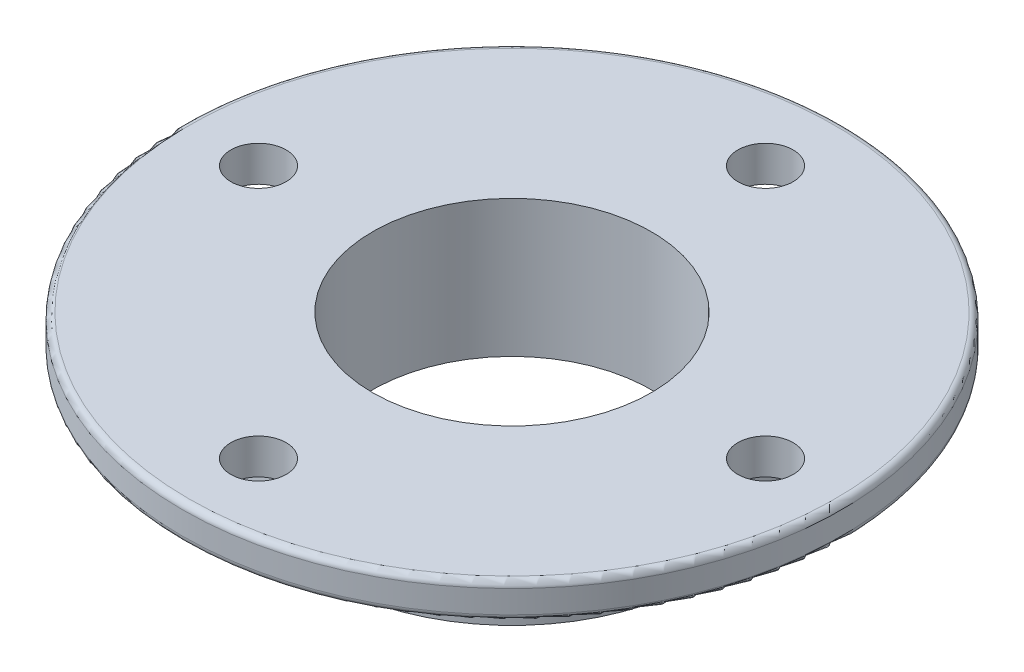
ISO-10303-21;
HEADER;
FILE_DESCRIPTION(('STEP AP214'),'2;1');
FILE_NAME('part.step','',(''),(''),'','','');
FILE_SCHEMA(('AUTOMOTIVE_DESIGN { 1 0 10303 214 1 1 1 1 }'));
ENDSEC;
DATA;
#1=APPLICATION_CONTEXT('core data for automotive mechanical design processes');
#2=APPLICATION_PROTOCOL_DEFINITION('international standard','automotive_design',2000,#1);
#3=PRODUCT_CONTEXT('',#1,'mechanical');
#4=PRODUCT('Part','Part','',(#3));
#5=PRODUCT_RELATED_PRODUCT_CATEGORY('part','',(#4));
#6=PRODUCT_DEFINITION_FORMATION('','',#4);
#7=PRODUCT_DEFINITION_CONTEXT('part definition',#1,'design');
#8=PRODUCT_DEFINITION('design','',#6,#7);
#9=PRODUCT_DEFINITION_SHAPE('','',#8);
#10=(LENGTH_UNIT() NAMED_UNIT(*) SI_UNIT(.MILLI.,.METRE.));
#11=(NAMED_UNIT(*) PLANE_ANGLE_UNIT() SI_UNIT($,.RADIAN.));
#12=(NAMED_UNIT(*) SI_UNIT($,.STERADIAN.) SOLID_ANGLE_UNIT());
#13=UNCERTAINTY_MEASURE_WITH_UNIT(LENGTH_MEASURE(1.E-05),#10,'distance_accuracy_value','');
#14=(GEOMETRIC_REPRESENTATION_CONTEXT(3) GLOBAL_UNCERTAINTY_ASSIGNED_CONTEXT((#13)) GLOBAL_UNIT_ASSIGNED_CONTEXT((#10,
#11,#12)) REPRESENTATION_CONTEXT('',''));
#15=CARTESIAN_POINT('',(0.,0.,0.));
#16=DIRECTION('',(0.,0.,1.));
#17=DIRECTION('',(1.,0.,0.));
#18=AXIS2_PLACEMENT_3D('',#15,#16,#17);
#19=CARTESIAN_POINT('',(0.,0.,0.));
#20=DIRECTION('',(0.,1.,0.));
#21=DIRECTION('',(0.,0.,1.));
#22=AXIS2_PLACEMENT_3D('',#19,#20,#21);
#23=PLANE('',#22);
#24=CARTESIAN_POINT('',(0.,0.,0.));
#25=DIRECTION('',(0.,1.,0.));
#26=DIRECTION('',(0.,0.,1.));
#27=AXIS2_PLACEMENT_3D('',#24,#25,#26);
#28=CIRCLE('',#27,7.5);
#29=CARTESIAN_POINT('',(0.,0.,7.5));
#30=VERTEX_POINT('',#29);
#31=EDGE_CURVE('E53',#30,#30,#28,.T.);
#32=ORIENTED_EDGE('',*,*,#31,.F.);
#33=EDGE_LOOP('',(#32));
#34=FACE_BOUND('',#33,.T.);
#35=CARTESIAN_POINT('',(0.,0.,0.));
#36=DIRECTION('',(0.,1.,0.));
#37=DIRECTION('',(0.,0.,1.));
#38=AXIS2_PLACEMENT_3D('',#35,#36,#37);
#39=CIRCLE('',#38,5.5);
#40=CARTESIAN_POINT('',(0.,0.,5.5));
#41=VERTEX_POINT('',#40);
#42=EDGE_CURVE('E56',#41,#41,#39,.T.);
#43=ORIENTED_EDGE('',*,*,#42,.T.);
#44=EDGE_LOOP('',(#43));
#45=FACE_BOUND('',#44,.T.);
#46=ADVANCED_FACE('F32',(#34,#45),#23,.F.);
#47=CARTESIAN_POINT('',(0.,4.,0.));
#48=DIRECTION('',(0.,-1.,0.));
#49=DIRECTION('',(0.,0.,-1.));
#50=AXIS2_PLACEMENT_3D('',#47,#48,#49);
#51=CYLINDRICAL_SURFACE('',#50,7.5);
#52=CARTESIAN_POINT('',(0.,4.,0.));
#53=DIRECTION('',(0.,1.,0.));
#54=DIRECTION('',(0.,0.,1.));
#55=AXIS2_PLACEMENT_3D('',#52,#53,#54);
#56=CIRCLE('',#55,7.5);
#57=CARTESIAN_POINT('',(0.,4.,7.5));
#58=VERTEX_POINT('',#57);
#59=EDGE_CURVE('E52',#58,#58,#56,.T.);
#60=ORIENTED_EDGE('',*,*,#59,.F.);
#61=EDGE_LOOP('',(#60));
#62=FACE_BOUND('',#61,.T.);
#63=ORIENTED_EDGE('',*,*,#31,.T.);
#64=EDGE_LOOP('',(#63));
#65=FACE_BOUND('',#64,.T.);
#66=ADVANCED_FACE('F108',(#62,#65),#51,.T.);
#67=CARTESIAN_POINT('',(0.,4.,0.));
#68=DIRECTION('',(0.,-1.,0.));
#69=DIRECTION('',(0.,0.,-1.));
#70=AXIS2_PLACEMENT_3D('',#67,#68,#69);
#71=CYLINDRICAL_SURFACE('',#70,5.5);
#72=ORIENTED_EDGE('',*,*,#42,.F.);
#73=EDGE_LOOP('',(#72));
#74=FACE_BOUND('',#73,.T.);
#75=CARTESIAN_POINT('',(0.,5.4,0.));
#76=DIRECTION('',(0.,1.,0.));
#77=DIRECTION('',(0.,0.,1.));
#78=AXIS2_PLACEMENT_3D('',#75,#76,#77);
#79=CIRCLE('',#78,5.5);
#80=CARTESIAN_POINT('',(0.,5.4,5.5));
#81=VERTEX_POINT('',#80);
#82=EDGE_CURVE('E61',#81,#81,#79,.T.);
#83=ORIENTED_EDGE('',*,*,#82,.T.);
#84=EDGE_LOOP('',(#83));
#85=FACE_BOUND('',#84,.T.);
#86=ADVANCED_FACE('F106',(#74,#85),#71,.F.);
#87=CARTESIAN_POINT('',(0.,4.,0.));
#88=DIRECTION('',(0.,1.,0.));
#89=DIRECTION('',(0.,0.,1.));
#90=AXIS2_PLACEMENT_3D('',#87,#88,#89);
#91=PLANE('',#90);
#92=CARTESIAN_POINT('',(0.,4.,0.));
#93=DIRECTION('',(0.,1.,0.));
#94=DIRECTION('',(0.,0.,1.));
#95=AXIS2_PLACEMENT_3D('',#92,#93,#94);
#96=CIRCLE('',#95,12.75);
#97=CARTESIAN_POINT('',(0.,4.,12.75));
#98=VERTEX_POINT('',#97);
#99=EDGE_CURVE('E39',#98,#98,#96,.F.);
#100=ORIENTED_EDGE('',*,*,#99,.T.);
#101=EDGE_LOOP('',(#100));
#102=FACE_BOUND('',#101,.T.);
#103=CARTESIAN_POINT('',(-10.,4.,-1.04744440165294E-13));
#104=DIRECTION('',(0.,1.,0.));
#105=DIRECTION('',(1.,0.,0.));
#106=AXIS2_PLACEMENT_3D('',#103,#104,#105);
#107=CIRCLE('',#106,1.09);
#108=CARTESIAN_POINT('',(-8.91,4.,0.));
#109=VERTEX_POINT('',#108);
#110=EDGE_CURVE('E82',#109,#109,#107,.T.);
#111=ORIENTED_EDGE('',*,*,#110,.T.);
#112=EDGE_LOOP('',(#111));
#113=FACE_BOUND('',#112,.T.);
#114=CARTESIAN_POINT('',(0.,4.,10.));
#115=DIRECTION('',(0.,1.,0.));
#116=DIRECTION('',(0.,0.,-1.));
#117=AXIS2_PLACEMENT_3D('',#114,#115,#116);
#118=CIRCLE('',#117,1.09);
#119=CARTESIAN_POINT('',(0.,4.,8.91));
#120=VERTEX_POINT('',#119);
#121=EDGE_CURVE('E76',#120,#120,#118,.T.);
#122=ORIENTED_EDGE('',*,*,#121,.T.);
#123=EDGE_LOOP('',(#122));
#124=FACE_BOUND('',#123,.T.);
#125=CARTESIAN_POINT('',(10.,4.,0.));
#126=DIRECTION('',(0.,1.,0.));
#127=DIRECTION('',(-1.,0.,0.));
#128=AXIS2_PLACEMENT_3D('',#125,#126,#127);
#129=CIRCLE('',#128,1.09);
#130=CARTESIAN_POINT('',(8.91,4.,0.));
#131=VERTEX_POINT('',#130);
#132=EDGE_CURVE('E70',#131,#131,#129,.T.);
#133=ORIENTED_EDGE('',*,*,#132,.T.);
#134=EDGE_LOOP('',(#133));
#135=FACE_BOUND('',#134,.T.);
#136=CARTESIAN_POINT('',(0.,4.,-10.));
#137=DIRECTION('',(0.,1.,0.));
#138=DIRECTION('',(0.,0.,1.));
#139=AXIS2_PLACEMENT_3D('',#136,#137,#138);
#140=CIRCLE('',#139,1.09);
#141=CARTESIAN_POINT('',(0.,4.,-8.91));
#142=VERTEX_POINT('',#141);
#143=EDGE_CURVE('E64',#142,#142,#140,.T.);
#144=ORIENTED_EDGE('',*,*,#143,.T.);
#145=EDGE_LOOP('',(#144));
#146=FACE_BOUND('',#145,.T.);
#147=ORIENTED_EDGE('',*,*,#59,.T.);
#148=EDGE_LOOP('',(#147));
#149=FACE_BOUND('',#148,.T.);
#150=ADVANCED_FACE('F96',(#102,#113,#124,#135,#146,#149),#91,.F.);
#151=CARTESIAN_POINT('',(0.,5.4,0.));
#152=DIRECTION('',(0.,1.,0.));
#153=DIRECTION('',(0.,0.,1.));
#154=AXIS2_PLACEMENT_3D('',#151,#152,#153);
#155=PLANE('',#154);
#156=CARTESIAN_POINT('',(0.,5.4,0.));
#157=DIRECTION('',(0.,1.,0.));
#158=DIRECTION('',(0.,0.,1.));
#159=AXIS2_PLACEMENT_3D('',#156,#157,#158);
#160=CIRCLE('',#159,12.75);
#161=CARTESIAN_POINT('',(0.,5.4,12.75));
#162=VERTEX_POINT('',#161);
#163=EDGE_CURVE('E10',#162,#162,#160,.T.);
#164=ORIENTED_EDGE('',*,*,#163,.T.);
#165=EDGE_LOOP('',(#164));
#166=FACE_BOUND('',#165,.T.);
#167=CARTESIAN_POINT('',(-10.,5.4,-1.04744440165294E-13));
#168=DIRECTION('',(0.,1.,0.));
#169=DIRECTION('',(1.,0.,0.));
#170=AXIS2_PLACEMENT_3D('',#167,#168,#169);
#171=CIRCLE('',#170,1.09);
#172=CARTESIAN_POINT('',(-8.91,5.4,0.));
#173=VERTEX_POINT('',#172);
#174=EDGE_CURVE('E85',#173,#173,#171,.T.);
#175=ORIENTED_EDGE('',*,*,#174,.F.);
#176=EDGE_LOOP('',(#175));
#177=FACE_BOUND('',#176,.T.);
#178=CARTESIAN_POINT('',(0.,5.4,10.));
#179=DIRECTION('',(0.,1.,0.));
#180=DIRECTION('',(0.,0.,-1.));
#181=AXIS2_PLACEMENT_3D('',#178,#179,#180);
#182=CIRCLE('',#181,1.09);
#183=CARTESIAN_POINT('',(0.,5.4,8.91));
#184=VERTEX_POINT('',#183);
#185=EDGE_CURVE('E79',#184,#184,#182,.T.);
#186=ORIENTED_EDGE('',*,*,#185,.F.);
#187=EDGE_LOOP('',(#186));
#188=FACE_BOUND('',#187,.T.);
#189=CARTESIAN_POINT('',(10.,5.4,0.));
#190=DIRECTION('',(0.,1.,0.));
#191=DIRECTION('',(-1.,0.,0.));
#192=AXIS2_PLACEMENT_3D('',#189,#190,#191);
#193=CIRCLE('',#192,1.09);
#194=CARTESIAN_POINT('',(8.91,5.4,0.));
#195=VERTEX_POINT('',#194);
#196=EDGE_CURVE('E73',#195,#195,#193,.T.);
#197=ORIENTED_EDGE('',*,*,#196,.F.);
#198=EDGE_LOOP('',(#197));
#199=FACE_BOUND('',#198,.T.);
#200=CARTESIAN_POINT('',(0.,5.4,-10.));
#201=DIRECTION('',(0.,1.,0.));
#202=DIRECTION('',(0.,0.,1.));
#203=AXIS2_PLACEMENT_3D('',#200,#201,#202);
#204=CIRCLE('',#203,1.09);
#205=CARTESIAN_POINT('',(0.,5.4,-8.91));
#206=VERTEX_POINT('',#205);
#207=EDGE_CURVE('E67',#206,#206,#204,.T.);
#208=ORIENTED_EDGE('',*,*,#207,.F.);
#209=EDGE_LOOP('',(#208));
#210=FACE_BOUND('',#209,.T.);
#211=ORIENTED_EDGE('',*,*,#82,.F.);
#212=EDGE_LOOP('',(#211));
#213=FACE_BOUND('',#212,.T.);
#214=ADVANCED_FACE('F92',(#166,#177,#188,#199,#210,#213),#155,.T.);
#215=CARTESIAN_POINT('',(0.,5.4,0.));
#216=DIRECTION('',(0.,-1.,0.));
#217=DIRECTION('',(0.,0.,-1.));
#218=AXIS2_PLACEMENT_3D('',#215,#216,#217);
#219=CYLINDRICAL_SURFACE('',#218,13.);
#220=CARTESIAN_POINT('',(0.,4.25,0.));
#221=DIRECTION('',(0.,1.,0.));
#222=DIRECTION('',(0.,0.,1.));
#223=AXIS2_PLACEMENT_3D('',#220,#221,#222);
#224=CIRCLE('',#223,13.);
#225=CARTESIAN_POINT('',(0.,4.25,13.));
#226=VERTEX_POINT('',#225);
#227=EDGE_CURVE('E43',#226,#226,#224,.T.);
#228=ORIENTED_EDGE('',*,*,#227,.T.);
#229=EDGE_LOOP('',(#228));
#230=FACE_BOUND('',#229,.T.);
#231=CARTESIAN_POINT('',(0.,5.15,0.));
#232=DIRECTION('',(0.,1.,0.));
#233=DIRECTION('',(0.,0.,1.));
#234=AXIS2_PLACEMENT_3D('',#231,#232,#233);
#235=CIRCLE('',#234,13.);
#236=CARTESIAN_POINT('',(0.,5.15,13.));
#237=VERTEX_POINT('',#236);
#238=EDGE_CURVE('E47',#237,#237,#235,.F.);
#239=ORIENTED_EDGE('',*,*,#238,.T.);
#240=EDGE_LOOP('',(#239));
#241=FACE_BOUND('',#240,.T.);
#242=ADVANCED_FACE('F95',(#230,#241),#219,.T.);
#243=CARTESIAN_POINT('',(0.,0.,-10.));
#244=DIRECTION('',(0.,1.,0.));
#245=DIRECTION('',(0.,0.,1.));
#246=AXIS2_PLACEMENT_3D('',#243,#244,#245);
#247=CYLINDRICAL_SURFACE('',#246,1.09);
#248=CARTESIAN_POINT('',(0.,5.4,-8.91));
#249=CARTESIAN_POINT('',(0.,5.38541666666667,-8.91));
#250=CARTESIAN_POINT('',(0.,5.37083333333333,-8.91));
#251=CARTESIAN_POINT('',(0.,5.34166666666667,-8.91));
#252=CARTESIAN_POINT('',(0.,5.32708333333333,-8.91));
#253=CARTESIAN_POINT('',(0.,5.29791666666667,-8.91));
#254=CARTESIAN_POINT('',(0.,5.28333333333333,-8.91));
#255=CARTESIAN_POINT('',(0.,5.25416666666667,-8.91));
#256=CARTESIAN_POINT('',(0.,5.23958333333333,-8.91));
#257=CARTESIAN_POINT('',(0.,5.21041666666667,-8.91));
#258=CARTESIAN_POINT('',(0.,5.19583333333333,-8.91));
#259=CARTESIAN_POINT('',(0.,5.16666666666667,-8.91));
#260=CARTESIAN_POINT('',(0.,5.15208333333333,-8.91));
#261=CARTESIAN_POINT('',(0.,5.12291666666667,-8.91));
#262=CARTESIAN_POINT('',(0.,5.10833333333333,-8.91));
#263=CARTESIAN_POINT('',(0.,5.07916666666667,-8.91));
#264=CARTESIAN_POINT('',(0.,5.06458333333333,-8.91));
#265=CARTESIAN_POINT('',(0.,5.03541666666667,-8.91));
#266=CARTESIAN_POINT('',(0.,5.02083333333333,-8.91));
#267=CARTESIAN_POINT('',(0.,4.99166666666667,-8.91));
#268=CARTESIAN_POINT('',(0.,4.97708333333333,-8.91));
#269=CARTESIAN_POINT('',(0.,4.94791666666667,-8.91));
#270=CARTESIAN_POINT('',(0.,4.93333333333333,-8.91));
#271=CARTESIAN_POINT('',(0.,4.90416666666667,-8.91));
#272=CARTESIAN_POINT('',(0.,4.88958333333333,-8.91));
#273=CARTESIAN_POINT('',(0.,4.86041666666667,-8.91));
#274=CARTESIAN_POINT('',(0.,4.84583333333333,-8.91));
#275=CARTESIAN_POINT('',(0.,4.81666666666667,-8.91));
#276=CARTESIAN_POINT('',(0.,4.80208333333333,-8.91));
#277=CARTESIAN_POINT('',(0.,4.77291666666667,-8.91));
#278=CARTESIAN_POINT('',(0.,4.75833333333333,-8.91));
#279=CARTESIAN_POINT('',(0.,4.72916666666667,-8.91));
#280=CARTESIAN_POINT('',(0.,4.71458333333333,-8.91));
#281=CARTESIAN_POINT('',(0.,4.68541666666667,-8.91));
#282=CARTESIAN_POINT('',(0.,4.67083333333333,-8.91));
#283=CARTESIAN_POINT('',(0.,4.64166666666667,-8.91));
#284=CARTESIAN_POINT('',(0.,4.62708333333333,-8.91));
#285=CARTESIAN_POINT('',(0.,4.59791666666667,-8.91));
#286=CARTESIAN_POINT('',(0.,4.58333333333333,-8.91));
#287=CARTESIAN_POINT('',(0.,4.55416666666667,-8.91));
#288=CARTESIAN_POINT('',(0.,4.53958333333333,-8.91));
#289=CARTESIAN_POINT('',(0.,4.51041666666667,-8.91));
#290=CARTESIAN_POINT('',(0.,4.49583333333333,-8.91));
#291=CARTESIAN_POINT('',(0.,4.46666666666667,-8.91));
#292=CARTESIAN_POINT('',(0.,4.45208333333333,-8.91));
#293=CARTESIAN_POINT('',(0.,4.42291666666667,-8.91));
#294=CARTESIAN_POINT('',(0.,4.40833333333333,-8.91));
#295=CARTESIAN_POINT('',(0.,4.37916666666667,-8.91));
#296=CARTESIAN_POINT('',(0.,4.36458333333333,-8.91));
#297=CARTESIAN_POINT('',(0.,4.33541666666667,-8.91));
#298=CARTESIAN_POINT('',(0.,4.32083333333333,-8.91));
#299=CARTESIAN_POINT('',(0.,4.29166666666667,-8.91));
#300=CARTESIAN_POINT('',(0.,4.27708333333333,-8.91));
#301=CARTESIAN_POINT('',(0.,4.24791666666667,-8.91));
#302=CARTESIAN_POINT('',(0.,4.23333333333333,-8.91));
#303=CARTESIAN_POINT('',(0.,4.20416666666667,-8.91));
#304=CARTESIAN_POINT('',(0.,4.18958333333333,-8.91));
#305=CARTESIAN_POINT('',(0.,4.16041666666667,-8.91));
#306=CARTESIAN_POINT('',(0.,4.14583333333333,-8.91));
#307=CARTESIAN_POINT('',(0.,4.11666666666667,-8.91));
#308=CARTESIAN_POINT('',(0.,4.10208333333333,-8.91));
#309=CARTESIAN_POINT('',(0.,4.07291666666667,-8.91));
#310=CARTESIAN_POINT('',(0.,4.05833333333333,-8.91));
#311=CARTESIAN_POINT('',(0.,4.02916666666667,-8.91));
#312=CARTESIAN_POINT('',(0.,4.01458333333333,-8.91));
#313=CARTESIAN_POINT('',(0.,4.,-8.91));
#314=B_SPLINE_CURVE_WITH_KNOTS('',3,(#248,#249,#250,#251,#252,#253,#254,#255,#256,#257,#258,
#259,#260,#261,#262,#263,#264,#265,#266,#267,#268,#269,#270,#271,#272,#273,#274,#275,#276,#277,
#278,#279,#280,#281,#282,#283,#284,#285,#286,#287,#288,#289,#290,#291,#292,#293,#294,#295,#296,
#297,#298,#299,#300,#301,#302,#303,#304,#305,#306,#307,#308,#309,#310,#311,#312,#313),
.UNSPECIFIED.,.F.,.F.,(4,2,2,2,2,2,2,2,2,2,2,2,2,2,2,2,2,2,2,2,2,2,2,2,2,2,2,2,2,2,2,2,4),(0.,
0.0437500000000004,0.0874999999999999,0.13125,0.175,0.21875,0.2625,0.30625,0.35,0.39375,0.4375,
0.48125,0.525,0.56875,0.6125,0.656250000000001,0.7,0.74375,0.7875,0.83125,0.875,0.91875,0.9625,
1.00625,1.05,1.09375,1.1375,1.18125,1.225,1.26875,1.3125,1.35625,1.4),.UNSPECIFIED.);
#315=EDGE_CURVE('BSEAM142',#206,#142,#314,.T.);
#316=ORIENTED_EDGE('',*,*,#207,.T.);
#317=ORIENTED_EDGE('',*,*,#143,.F.);
#318=ORIENTED_EDGE('',*,*,#315,.T.);
#319=ORIENTED_EDGE('',*,*,#315,.F.);
#320=EDGE_LOOP('',(#316,#318,#317,#319));
#321=FACE_BOUND('',#320,.T.);
#322=ADVANCED_FACE('F142',(#321),#247,.F.);
#323=CARTESIAN_POINT('',(10.,0.,0.));
#324=DIRECTION('',(0.,1.,0.));
#325=DIRECTION('',(-1.,0.,0.));
#326=AXIS2_PLACEMENT_3D('',#323,#324,#325);
#327=CYLINDRICAL_SURFACE('',#326,1.09);
#328=CARTESIAN_POINT('',(8.91,5.4,0.));
#329=CARTESIAN_POINT('',(8.91,5.38541666666667,0.));
#330=CARTESIAN_POINT('',(8.91,5.37083333333333,0.));
#331=CARTESIAN_POINT('',(8.91,5.34166666666667,0.));
#332=CARTESIAN_POINT('',(8.91,5.32708333333333,0.));
#333=CARTESIAN_POINT('',(8.91,5.29791666666667,0.));
#334=CARTESIAN_POINT('',(8.91,5.28333333333333,0.));
#335=CARTESIAN_POINT('',(8.91,5.25416666666667,0.));
#336=CARTESIAN_POINT('',(8.91,5.23958333333333,0.));
#337=CARTESIAN_POINT('',(8.91,5.21041666666667,0.));
#338=CARTESIAN_POINT('',(8.91,5.19583333333333,0.));
#339=CARTESIAN_POINT('',(8.91,5.16666666666667,0.));
#340=CARTESIAN_POINT('',(8.91,5.15208333333333,0.));
#341=CARTESIAN_POINT('',(8.91,5.12291666666667,0.));
#342=CARTESIAN_POINT('',(8.91,5.10833333333333,0.));
#343=CARTESIAN_POINT('',(8.91,5.07916666666667,0.));
#344=CARTESIAN_POINT('',(8.91,5.06458333333333,0.));
#345=CARTESIAN_POINT('',(8.91,5.03541666666667,0.));
#346=CARTESIAN_POINT('',(8.91,5.02083333333333,0.));
#347=CARTESIAN_POINT('',(8.91,4.99166666666667,0.));
#348=CARTESIAN_POINT('',(8.91,4.97708333333333,0.));
#349=CARTESIAN_POINT('',(8.91,4.94791666666667,0.));
#350=CARTESIAN_POINT('',(8.91,4.93333333333333,0.));
#351=CARTESIAN_POINT('',(8.91,4.90416666666667,0.));
#352=CARTESIAN_POINT('',(8.91,4.88958333333333,0.));
#353=CARTESIAN_POINT('',(8.91,4.86041666666667,0.));
#354=CARTESIAN_POINT('',(8.91,4.84583333333333,0.));
#355=CARTESIAN_POINT('',(8.91,4.81666666666667,0.));
#356=CARTESIAN_POINT('',(8.91,4.80208333333333,0.));
#357=CARTESIAN_POINT('',(8.91,4.77291666666667,0.));
#358=CARTESIAN_POINT('',(8.91,4.75833333333333,0.));
#359=CARTESIAN_POINT('',(8.91,4.72916666666667,0.));
#360=CARTESIAN_POINT('',(8.91,4.71458333333333,0.));
#361=CARTESIAN_POINT('',(8.91,4.68541666666667,0.));
#362=CARTESIAN_POINT('',(8.91,4.67083333333333,0.));
#363=CARTESIAN_POINT('',(8.91,4.64166666666667,0.));
#364=CARTESIAN_POINT('',(8.91,4.62708333333333,0.));
#365=CARTESIAN_POINT('',(8.91,4.59791666666667,0.));
#366=CARTESIAN_POINT('',(8.91,4.58333333333333,0.));
#367=CARTESIAN_POINT('',(8.91,4.55416666666667,0.));
#368=CARTESIAN_POINT('',(8.91,4.53958333333333,0.));
#369=CARTESIAN_POINT('',(8.91,4.51041666666667,0.));
#370=CARTESIAN_POINT('',(8.91,4.49583333333333,0.));
#371=CARTESIAN_POINT('',(8.91,4.46666666666667,0.));
#372=CARTESIAN_POINT('',(8.91,4.45208333333333,0.));
#373=CARTESIAN_POINT('',(8.91,4.42291666666667,0.));
#374=CARTESIAN_POINT('',(8.91,4.40833333333333,0.));
#375=CARTESIAN_POINT('',(8.91,4.37916666666667,0.));
#376=CARTESIAN_POINT('',(8.91,4.36458333333333,0.));
#377=CARTESIAN_POINT('',(8.91,4.33541666666667,0.));
#378=CARTESIAN_POINT('',(8.91,4.32083333333333,0.));
#379=CARTESIAN_POINT('',(8.91,4.29166666666667,0.));
#380=CARTESIAN_POINT('',(8.91,4.27708333333333,0.));
#381=CARTESIAN_POINT('',(8.91,4.24791666666667,0.));
#382=CARTESIAN_POINT('',(8.91,4.23333333333333,0.));
#383=CARTESIAN_POINT('',(8.91,4.20416666666667,0.));
#384=CARTESIAN_POINT('',(8.91,4.18958333333333,0.));
#385=CARTESIAN_POINT('',(8.91,4.16041666666667,0.));
#386=CARTESIAN_POINT('',(8.91,4.14583333333333,0.));
#387=CARTESIAN_POINT('',(8.91,4.11666666666667,0.));
#388=CARTESIAN_POINT('',(8.91,4.10208333333333,0.));
#389=CARTESIAN_POINT('',(8.91,4.07291666666667,0.));
#390=CARTESIAN_POINT('',(8.91,4.05833333333333,0.));
#391=CARTESIAN_POINT('',(8.91,4.02916666666667,0.));
#392=CARTESIAN_POINT('',(8.91,4.01458333333333,0.));
#393=CARTESIAN_POINT('',(8.91,4.,0.));
#394=B_SPLINE_CURVE_WITH_KNOTS('',3,(#328,#329,#330,#331,#332,#333,#334,#335,#336,#337,#338,
#339,#340,#341,#342,#343,#344,#345,#346,#347,#348,#349,#350,#351,#352,#353,#354,#355,#356,#357,
#358,#359,#360,#361,#362,#363,#364,#365,#366,#367,#368,#369,#370,#371,#372,#373,#374,#375,#376,
#377,#378,#379,#380,#381,#382,#383,#384,#385,#386,#387,#388,#389,#390,#391,#392,#393),
.UNSPECIFIED.,.F.,.F.,(4,2,2,2,2,2,2,2,2,2,2,2,2,2,2,2,2,2,2,2,2,2,2,2,2,2,2,2,2,2,2,2,4),(0.,
0.0437500000000004,0.0874999999999999,0.13125,0.175,0.21875,0.2625,0.30625,0.35,0.39375,0.4375,
0.48125,0.525,0.56875,0.6125,0.656250000000001,0.7,0.74375,0.7875,0.83125,0.875,0.91875,0.9625,
1.00625,1.05,1.09375,1.1375,1.18125,1.225,1.26875,1.3125,1.35625,1.4),.UNSPECIFIED.);
#395=EDGE_CURVE('BSEAM148',#195,#131,#394,.T.);
#396=ORIENTED_EDGE('',*,*,#196,.T.);
#397=ORIENTED_EDGE('',*,*,#132,.F.);
#398=ORIENTED_EDGE('',*,*,#395,.T.);
#399=ORIENTED_EDGE('',*,*,#395,.F.);
#400=EDGE_LOOP('',(#396,#398,#397,#399));
#401=FACE_BOUND('',#400,.T.);
#402=ADVANCED_FACE('F148',(#401),#327,.F.);
#403=CARTESIAN_POINT('',(0.,0.,10.));
#404=DIRECTION('',(0.,1.,0.));
#405=DIRECTION('',(0.,0.,-1.));
#406=AXIS2_PLACEMENT_3D('',#403,#404,#405);
#407=CYLINDRICAL_SURFACE('',#406,1.09);
#408=CARTESIAN_POINT('',(0.,5.4,8.91));
#409=CARTESIAN_POINT('',(0.,5.38541666666667,8.91));
#410=CARTESIAN_POINT('',(0.,5.37083333333333,8.91));
#411=CARTESIAN_POINT('',(0.,5.34166666666667,8.91));
#412=CARTESIAN_POINT('',(0.,5.32708333333333,8.91));
#413=CARTESIAN_POINT('',(0.,5.29791666666667,8.91));
#414=CARTESIAN_POINT('',(0.,5.28333333333333,8.91));
#415=CARTESIAN_POINT('',(0.,5.25416666666667,8.91));
#416=CARTESIAN_POINT('',(0.,5.23958333333333,8.91));
#417=CARTESIAN_POINT('',(0.,5.21041666666667,8.91));
#418=CARTESIAN_POINT('',(0.,5.19583333333333,8.91));
#419=CARTESIAN_POINT('',(0.,5.16666666666667,8.91));
#420=CARTESIAN_POINT('',(0.,5.15208333333333,8.91));
#421=CARTESIAN_POINT('',(0.,5.12291666666667,8.91));
#422=CARTESIAN_POINT('',(0.,5.10833333333333,8.91));
#423=CARTESIAN_POINT('',(0.,5.07916666666667,8.91));
#424=CARTESIAN_POINT('',(0.,5.06458333333333,8.91));
#425=CARTESIAN_POINT('',(0.,5.03541666666667,8.91));
#426=CARTESIAN_POINT('',(0.,5.02083333333333,8.91));
#427=CARTESIAN_POINT('',(0.,4.99166666666667,8.91));
#428=CARTESIAN_POINT('',(0.,4.97708333333333,8.91));
#429=CARTESIAN_POINT('',(0.,4.94791666666667,8.91));
#430=CARTESIAN_POINT('',(0.,4.93333333333333,8.91));
#431=CARTESIAN_POINT('',(0.,4.90416666666667,8.91));
#432=CARTESIAN_POINT('',(0.,4.88958333333333,8.91));
#433=CARTESIAN_POINT('',(0.,4.86041666666667,8.91));
#434=CARTESIAN_POINT('',(0.,4.84583333333333,8.91));
#435=CARTESIAN_POINT('',(0.,4.81666666666667,8.91));
#436=CARTESIAN_POINT('',(0.,4.80208333333333,8.91));
#437=CARTESIAN_POINT('',(0.,4.77291666666667,8.91));
#438=CARTESIAN_POINT('',(0.,4.75833333333333,8.91));
#439=CARTESIAN_POINT('',(0.,4.72916666666667,8.91));
#440=CARTESIAN_POINT('',(0.,4.71458333333333,8.91));
#441=CARTESIAN_POINT('',(0.,4.68541666666667,8.91));
#442=CARTESIAN_POINT('',(0.,4.67083333333333,8.91));
#443=CARTESIAN_POINT('',(0.,4.64166666666667,8.91));
#444=CARTESIAN_POINT('',(0.,4.62708333333333,8.91));
#445=CARTESIAN_POINT('',(0.,4.59791666666667,8.91));
#446=CARTESIAN_POINT('',(0.,4.58333333333333,8.91));
#447=CARTESIAN_POINT('',(0.,4.55416666666667,8.91));
#448=CARTESIAN_POINT('',(0.,4.53958333333333,8.91));
#449=CARTESIAN_POINT('',(0.,4.51041666666667,8.91));
#450=CARTESIAN_POINT('',(0.,4.49583333333333,8.91));
#451=CARTESIAN_POINT('',(0.,4.46666666666667,8.91));
#452=CARTESIAN_POINT('',(0.,4.45208333333333,8.91));
#453=CARTESIAN_POINT('',(0.,4.42291666666667,8.91));
#454=CARTESIAN_POINT('',(0.,4.40833333333333,8.91));
#455=CARTESIAN_POINT('',(0.,4.37916666666667,8.91));
#456=CARTESIAN_POINT('',(0.,4.36458333333333,8.91));
#457=CARTESIAN_POINT('',(0.,4.33541666666667,8.91));
#458=CARTESIAN_POINT('',(0.,4.32083333333333,8.91));
#459=CARTESIAN_POINT('',(0.,4.29166666666667,8.91));
#460=CARTESIAN_POINT('',(0.,4.27708333333333,8.91));
#461=CARTESIAN_POINT('',(0.,4.24791666666667,8.91));
#462=CARTESIAN_POINT('',(0.,4.23333333333333,8.91));
#463=CARTESIAN_POINT('',(0.,4.20416666666667,8.91));
#464=CARTESIAN_POINT('',(0.,4.18958333333333,8.91));
#465=CARTESIAN_POINT('',(0.,4.16041666666667,8.91));
#466=CARTESIAN_POINT('',(0.,4.14583333333333,8.91));
#467=CARTESIAN_POINT('',(0.,4.11666666666667,8.91));
#468=CARTESIAN_POINT('',(0.,4.10208333333333,8.91));
#469=CARTESIAN_POINT('',(0.,4.07291666666667,8.91));
#470=CARTESIAN_POINT('',(0.,4.05833333333333,8.91));
#471=CARTESIAN_POINT('',(0.,4.02916666666667,8.91));
#472=CARTESIAN_POINT('',(0.,4.01458333333333,8.91));
#473=CARTESIAN_POINT('',(0.,4.,8.91));
#474=B_SPLINE_CURVE_WITH_KNOTS('',3,(#408,#409,#410,#411,#412,#413,#414,#415,#416,#417,#418,
#419,#420,#421,#422,#423,#424,#425,#426,#427,#428,#429,#430,#431,#432,#433,#434,#435,#436,#437,
#438,#439,#440,#441,#442,#443,#444,#445,#446,#447,#448,#449,#450,#451,#452,#453,#454,#455,#456,
#457,#458,#459,#460,#461,#462,#463,#464,#465,#466,#467,#468,#469,#470,#471,#472,#473),
.UNSPECIFIED.,.F.,.F.,(4,2,2,2,2,2,2,2,2,2,2,2,2,2,2,2,2,2,2,2,2,2,2,2,2,2,2,2,2,2,2,2,4),(0.,
0.0437500000000004,0.0874999999999999,0.13125,0.175,0.21875,0.2625,0.30625,0.35,0.39375,0.4375,
0.48125,0.525,0.56875,0.6125,0.656250000000001,0.7,0.74375,0.7875,0.83125,0.875,0.91875,0.9625,
1.00625,1.05,1.09375,1.1375,1.18125,1.225,1.26875,1.3125,1.35625,1.4),.UNSPECIFIED.);
#475=EDGE_CURVE('BSEAM135',#184,#120,#474,.T.);
#476=ORIENTED_EDGE('',*,*,#185,.T.);
#477=ORIENTED_EDGE('',*,*,#121,.F.);
#478=ORIENTED_EDGE('',*,*,#475,.T.);
#479=ORIENTED_EDGE('',*,*,#475,.F.);
#480=EDGE_LOOP('',(#476,#478,#477,#479));
#481=FACE_BOUND('',#480,.T.);
#482=ADVANCED_FACE('F135',(#481),#407,.F.);
#483=CARTESIAN_POINT('',(-10.,0.,-1.04744440165294E-13));
#484=DIRECTION('',(0.,1.,0.));
#485=DIRECTION('',(1.,0.,0.));
#486=AXIS2_PLACEMENT_3D('',#483,#484,#485);
#487=CYLINDRICAL_SURFACE('',#486,1.09);
#488=CARTESIAN_POINT('',(-8.91,5.4,0.));
#489=CARTESIAN_POINT('',(-8.91,5.38541666666667,0.));
#490=CARTESIAN_POINT('',(-8.91,5.37083333333333,0.));
#491=CARTESIAN_POINT('',(-8.91,5.34166666666667,0.));
#492=CARTESIAN_POINT('',(-8.91,5.32708333333333,0.));
#493=CARTESIAN_POINT('',(-8.91,5.29791666666667,0.));
#494=CARTESIAN_POINT('',(-8.91,5.28333333333333,0.));
#495=CARTESIAN_POINT('',(-8.91,5.25416666666667,0.));
#496=CARTESIAN_POINT('',(-8.91,5.23958333333333,0.));
#497=CARTESIAN_POINT('',(-8.91,5.21041666666667,0.));
#498=CARTESIAN_POINT('',(-8.91,5.19583333333333,0.));
#499=CARTESIAN_POINT('',(-8.91,5.16666666666667,0.));
#500=CARTESIAN_POINT('',(-8.91,5.15208333333333,0.));
#501=CARTESIAN_POINT('',(-8.91,5.12291666666667,0.));
#502=CARTESIAN_POINT('',(-8.91,5.10833333333333,0.));
#503=CARTESIAN_POINT('',(-8.91,5.07916666666667,0.));
#504=CARTESIAN_POINT('',(-8.91,5.06458333333333,0.));
#505=CARTESIAN_POINT('',(-8.91,5.03541666666667,0.));
#506=CARTESIAN_POINT('',(-8.91,5.02083333333333,0.));
#507=CARTESIAN_POINT('',(-8.91,4.99166666666667,0.));
#508=CARTESIAN_POINT('',(-8.91,4.97708333333333,0.));
#509=CARTESIAN_POINT('',(-8.91,4.94791666666667,0.));
#510=CARTESIAN_POINT('',(-8.91,4.93333333333333,0.));
#511=CARTESIAN_POINT('',(-8.91,4.90416666666667,0.));
#512=CARTESIAN_POINT('',(-8.91,4.88958333333333,0.));
#513=CARTESIAN_POINT('',(-8.91,4.86041666666667,0.));
#514=CARTESIAN_POINT('',(-8.91,4.84583333333333,0.));
#515=CARTESIAN_POINT('',(-8.91,4.81666666666667,0.));
#516=CARTESIAN_POINT('',(-8.91,4.80208333333333,0.));
#517=CARTESIAN_POINT('',(-8.91,4.77291666666667,0.));
#518=CARTESIAN_POINT('',(-8.91,4.75833333333333,0.));
#519=CARTESIAN_POINT('',(-8.91,4.72916666666667,0.));
#520=CARTESIAN_POINT('',(-8.91,4.71458333333333,0.));
#521=CARTESIAN_POINT('',(-8.91,4.68541666666667,0.));
#522=CARTESIAN_POINT('',(-8.91,4.67083333333333,0.));
#523=CARTESIAN_POINT('',(-8.91,4.64166666666667,0.));
#524=CARTESIAN_POINT('',(-8.91,4.62708333333333,0.));
#525=CARTESIAN_POINT('',(-8.91,4.59791666666667,0.));
#526=CARTESIAN_POINT('',(-8.91,4.58333333333333,0.));
#527=CARTESIAN_POINT('',(-8.91,4.55416666666667,0.));
#528=CARTESIAN_POINT('',(-8.91,4.53958333333333,0.));
#529=CARTESIAN_POINT('',(-8.91,4.51041666666667,0.));
#530=CARTESIAN_POINT('',(-8.91,4.49583333333333,0.));
#531=CARTESIAN_POINT('',(-8.91,4.46666666666667,0.));
#532=CARTESIAN_POINT('',(-8.91,4.45208333333333,0.));
#533=CARTESIAN_POINT('',(-8.91,4.42291666666667,0.));
#534=CARTESIAN_POINT('',(-8.91,4.40833333333333,0.));
#535=CARTESIAN_POINT('',(-8.91,4.37916666666667,0.));
#536=CARTESIAN_POINT('',(-8.91,4.36458333333333,0.));
#537=CARTESIAN_POINT('',(-8.91,4.33541666666667,0.));
#538=CARTESIAN_POINT('',(-8.91,4.32083333333333,0.));
#539=CARTESIAN_POINT('',(-8.91,4.29166666666667,0.));
#540=CARTESIAN_POINT('',(-8.91,4.27708333333333,0.));
#541=CARTESIAN_POINT('',(-8.91,4.24791666666667,0.));
#542=CARTESIAN_POINT('',(-8.91,4.23333333333333,0.));
#543=CARTESIAN_POINT('',(-8.91,4.20416666666667,0.));
#544=CARTESIAN_POINT('',(-8.91,4.18958333333333,0.));
#545=CARTESIAN_POINT('',(-8.91,4.16041666666667,0.));
#546=CARTESIAN_POINT('',(-8.91,4.14583333333333,0.));
#547=CARTESIAN_POINT('',(-8.91,4.11666666666667,0.));
#548=CARTESIAN_POINT('',(-8.91,4.10208333333333,0.));
#549=CARTESIAN_POINT('',(-8.91,4.07291666666667,0.));
#550=CARTESIAN_POINT('',(-8.91,4.05833333333333,0.));
#551=CARTESIAN_POINT('',(-8.91,4.02916666666667,0.));
#552=CARTESIAN_POINT('',(-8.91,4.01458333333333,0.));
#553=CARTESIAN_POINT('',(-8.91,4.,0.));
#554=B_SPLINE_CURVE_WITH_KNOTS('',3,(#488,#489,#490,#491,#492,#493,#494,#495,#496,#497,#498,
#499,#500,#501,#502,#503,#504,#505,#506,#507,#508,#509,#510,#511,#512,#513,#514,#515,#516,#517,
#518,#519,#520,#521,#522,#523,#524,#525,#526,#527,#528,#529,#530,#531,#532,#533,#534,#535,#536,
#537,#538,#539,#540,#541,#542,#543,#544,#545,#546,#547,#548,#549,#550,#551,#552,#553),
.UNSPECIFIED.,.F.,.F.,(4,2,2,2,2,2,2,2,2,2,2,2,2,2,2,2,2,2,2,2,2,2,2,2,2,2,2,2,2,2,2,2,4),(0.,
0.0437500000000004,0.0874999999999999,0.13125,0.175,0.21875,0.2625,0.30625,0.35,0.39375,0.4375,
0.48125,0.525,0.56875,0.6125,0.656250000000001,0.7,0.74375,0.7875,0.83125,0.875,0.91875,0.9625,
1.00625,1.05,1.09375,1.1375,1.18125,1.225,1.26875,1.3125,1.35625,1.4),.UNSPECIFIED.);
#555=EDGE_CURVE('BSEAM89',#173,#109,#554,.T.);
#556=ORIENTED_EDGE('',*,*,#174,.T.);
#557=ORIENTED_EDGE('',*,*,#110,.F.);
#558=ORIENTED_EDGE('',*,*,#555,.T.);
#559=ORIENTED_EDGE('',*,*,#555,.F.);
#560=EDGE_LOOP('',(#556,#558,#557,#559));
#561=FACE_BOUND('',#560,.T.);
#562=ADVANCED_FACE('F89',(#561),#487,.F.);
#563=CARTESIAN_POINT('',(0.,4.25,0.));
#564=DIRECTION('',(0.,1.,0.));
#565=DIRECTION('',(0.,0.,1.));
#566=AXIS2_PLACEMENT_3D('',#563,#564,#565);
#567=TOROIDAL_SURFACE('',#566,12.75,0.25);
#568=ORIENTED_EDGE('',*,*,#99,.F.);
#569=EDGE_LOOP('',(#568));
#570=FACE_BOUND('',#569,.T.);
#571=ORIENTED_EDGE('',*,*,#227,.F.);
#572=EDGE_LOOP('',(#571));
#573=FACE_BOUND('',#572,.T.);
#574=ADVANCED_FACE('F127',(#570,#573),#567,.T.);
#575=CARTESIAN_POINT('',(0.,5.15,0.));
#576=DIRECTION('',(0.,1.,0.));
#577=DIRECTION('',(0.,0.,1.));
#578=AXIS2_PLACEMENT_3D('',#575,#576,#577);
#579=TOROIDAL_SURFACE('',#578,12.75,0.25);
#580=ORIENTED_EDGE('',*,*,#238,.F.);
#581=EDGE_LOOP('',(#580));
#582=FACE_BOUND('',#581,.T.);
#583=ORIENTED_EDGE('',*,*,#163,.F.);
#584=EDGE_LOOP('',(#583));
#585=FACE_BOUND('',#584,.T.);
#586=ADVANCED_FACE('F34',(#582,#585),#579,.T.);
#587=CLOSED_SHELL('',(#46,#66,#86,#150,#214,#242,#322,#402,#482,#562,#574,#586));
#588=MANIFOLD_SOLID_BREP('B2',#587);
#589=ADVANCED_BREP_SHAPE_REPRESENTATION('',(#18,#588),#14);
#590=SHAPE_DEFINITION_REPRESENTATION(#9,#589);
ENDSEC;
END-ISO-10303-21;
